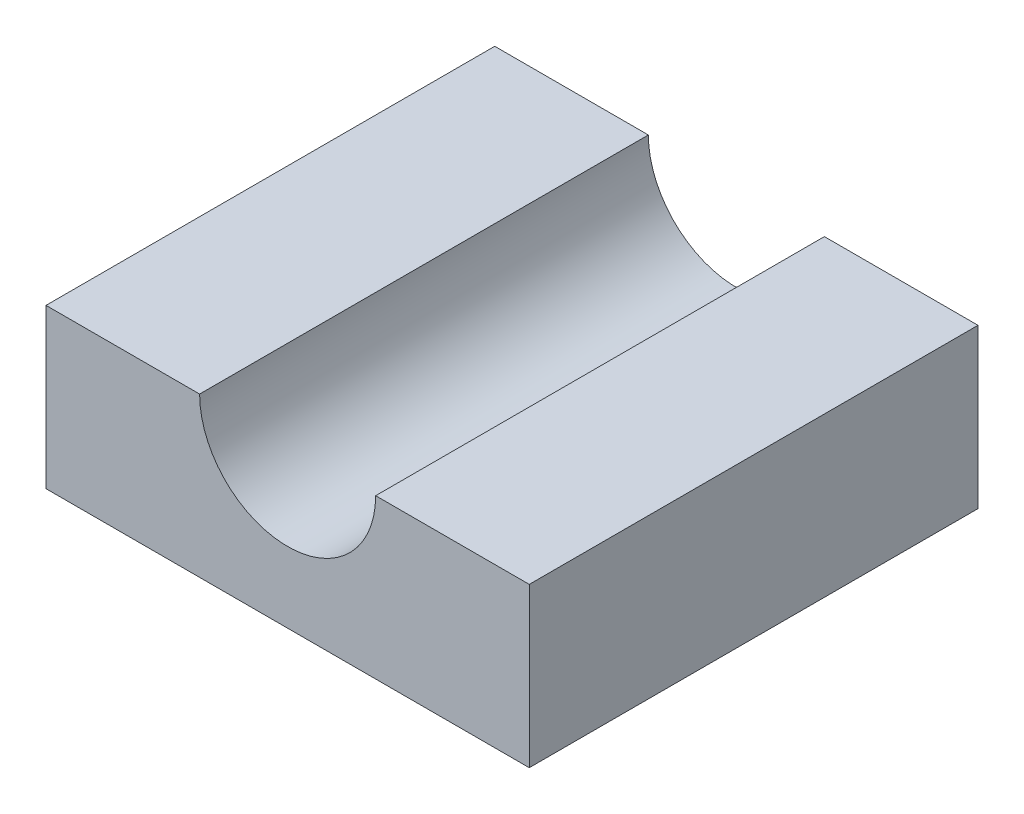
ISO-10303-21;
HEADER;
FILE_DESCRIPTION(('STEP AP214'),'2;1');
FILE_NAME('part.step','',(''),(''),'','','');
FILE_SCHEMA(('AUTOMOTIVE_DESIGN { 1 0 10303 214 1 1 1 1 }'));
ENDSEC;
DATA;
#1=APPLICATION_CONTEXT('core data for automotive mechanical design processes');
#2=APPLICATION_PROTOCOL_DEFINITION('international standard','automotive_design',2000,#1);
#3=PRODUCT_CONTEXT('',#1,'mechanical');
#4=PRODUCT('Part','Part','',(#3));
#5=PRODUCT_RELATED_PRODUCT_CATEGORY('part','',(#4));
#6=PRODUCT_DEFINITION_FORMATION('','',#4);
#7=PRODUCT_DEFINITION_CONTEXT('part definition',#1,'design');
#8=PRODUCT_DEFINITION('design','',#6,#7);
#9=PRODUCT_DEFINITION_SHAPE('','',#8);
#10=(LENGTH_UNIT() NAMED_UNIT(*) SI_UNIT(.MILLI.,.METRE.));
#11=(NAMED_UNIT(*) PLANE_ANGLE_UNIT() SI_UNIT($,.RADIAN.));
#12=(NAMED_UNIT(*) SI_UNIT($,.STERADIAN.) SOLID_ANGLE_UNIT());
#13=UNCERTAINTY_MEASURE_WITH_UNIT(LENGTH_MEASURE(1.E-05),#10,'distance_accuracy_value','');
#14=(GEOMETRIC_REPRESENTATION_CONTEXT(3) GLOBAL_UNCERTAINTY_ASSIGNED_CONTEXT((#13)) GLOBAL_UNIT_ASSIGNED_CONTEXT((#10,
#11,#12)) REPRESENTATION_CONTEXT('',''));
#15=CARTESIAN_POINT('',(0.,0.,0.));
#16=DIRECTION('',(0.,0.,1.));
#17=DIRECTION('',(1.,0.,0.));
#18=AXIS2_PLACEMENT_3D('',#15,#16,#17);
#19=CARTESIAN_POINT('',(0.,0.,-8.));
#20=DIRECTION('',(0.,0.,1.));
#21=DIRECTION('',(1.,0.,0.));
#22=AXIS2_PLACEMENT_3D('',#19,#20,#21);
#23=CYLINDRICAL_SURFACE('',#22,2.55);
#24=DIRECTION('',(0.,0.,1.));
#25=VECTOR('',#24,1.);
#26=CARTESIAN_POINT('',(2.55,0.,0.));
#27=LINE('',#26,#25);
#28=CARTESIAN_POINT('',(2.55,0.,6.));
#29=VERTEX_POINT('',#28);
#30=CARTESIAN_POINT('',(2.55,0.,-7.));
#31=VERTEX_POINT('',#30);
#32=EDGE_CURVE('E77',#29,#31,#27,.F.);
#33=ORIENTED_EDGE('',*,*,#32,.T.);
#34=CARTESIAN_POINT('',(0.,0.,-7.));
#35=DIRECTION('',(0.,0.,1.));
#36=DIRECTION('',(1.,0.,0.));
#37=AXIS2_PLACEMENT_3D('',#34,#35,#36);
#38=CIRCLE('',#37,2.55);
#39=CARTESIAN_POINT('',(-2.55,0.,-7.));
#40=VERTEX_POINT('',#39);
#41=EDGE_CURVE('E71',#40,#31,#38,.T.);
#42=ORIENTED_EDGE('',*,*,#41,.F.);
#43=DIRECTION('',(0.,0.,1.));
#44=VECTOR('',#43,1.);
#45=CARTESIAN_POINT('',(-2.55,0.,0.));
#46=LINE('',#45,#44);
#47=CARTESIAN_POINT('',(-2.55,0.,6.));
#48=VERTEX_POINT('',#47);
#49=EDGE_CURVE('E68',#40,#48,#46,.T.);
#50=ORIENTED_EDGE('',*,*,#49,.T.);
#51=CARTESIAN_POINT('',(0.,0.,6.));
#52=DIRECTION('',(0.,0.,1.));
#53=DIRECTION('',(1.,0.,0.));
#54=AXIS2_PLACEMENT_3D('',#51,#52,#53);
#55=CIRCLE('',#54,2.55);
#56=EDGE_CURVE('E19',#29,#48,#55,.F.);
#57=ORIENTED_EDGE('',*,*,#56,.F.);
#58=EDGE_LOOP('',(#33,#42,#50,#57));
#59=FACE_BOUND('',#58,.T.);
#60=ADVANCED_FACE('F16',(#59),#23,.F.);
#61=CARTESIAN_POINT('',(0.,0.,0.));
#62=DIRECTION('',(0.,-1.,0.));
#63=DIRECTION('',(1.,0.,0.));
#64=AXIS2_PLACEMENT_3D('',#61,#62,#63);
#65=PLANE('',#64);
#66=DIRECTION('',(1.,0.,0.));
#67=VECTOR('',#66,1.);
#68=CARTESIAN_POINT('',(7.,0.,6.));
#69=LINE('',#68,#67);
#70=CARTESIAN_POINT('',(7.,0.,6.));
#71=VERTEX_POINT('',#70);
#72=EDGE_CURVE('E92',#71,#29,#69,.F.);
#73=ORIENTED_EDGE('',*,*,#72,.F.);
#74=DIRECTION('',(0.,0.,1.));
#75=VECTOR('',#74,1.);
#76=CARTESIAN_POINT('',(7.,0.,-7.));
#77=LINE('',#76,#75);
#78=CARTESIAN_POINT('',(7.,0.,-7.));
#79=VERTEX_POINT('',#78);
#80=EDGE_CURVE('E76',#79,#71,#77,.T.);
#81=ORIENTED_EDGE('',*,*,#80,.F.);
#82=DIRECTION('',(-1.,0.,0.));
#83=VECTOR('',#82,1.);
#84=CARTESIAN_POINT('',(-7.,0.,-7.));
#85=LINE('',#84,#83);
#86=EDGE_CURVE('E129',#31,#79,#85,.F.);
#87=ORIENTED_EDGE('',*,*,#86,.F.);
#88=ORIENTED_EDGE('',*,*,#32,.F.);
#89=EDGE_LOOP('',(#73,#81,#87,#88));
#90=FACE_BOUND('',#89,.T.);
#91=ADVANCED_FACE('F165',(#90),#65,.F.);
#92=CARTESIAN_POINT('',(0.,0.,0.));
#93=DIRECTION('',(0.,-1.,0.));
#94=DIRECTION('',(1.,0.,0.));
#95=AXIS2_PLACEMENT_3D('',#92,#93,#94);
#96=PLANE('',#95);
#97=DIRECTION('',(-1.,0.,0.));
#98=VECTOR('',#97,1.);
#99=CARTESIAN_POINT('',(-7.,0.,-7.));
#100=LINE('',#99,#98);
#101=CARTESIAN_POINT('',(-7.,0.,-7.));
#102=VERTEX_POINT('',#101);
#103=EDGE_CURVE('E127',#102,#40,#100,.F.);
#104=ORIENTED_EDGE('',*,*,#103,.F.);
#105=DIRECTION('',(0.,0.,1.));
#106=VECTOR('',#105,1.);
#107=CARTESIAN_POINT('',(-7.,0.,6.));
#108=LINE('',#107,#106);
#109=CARTESIAN_POINT('',(-7.,0.,6.));
#110=VERTEX_POINT('',#109);
#111=EDGE_CURVE('E82',#110,#102,#108,.F.);
#112=ORIENTED_EDGE('',*,*,#111,.F.);
#113=DIRECTION('',(1.,0.,0.));
#114=VECTOR('',#113,1.);
#115=CARTESIAN_POINT('',(7.,0.,6.));
#116=LINE('',#115,#114);
#117=EDGE_CURVE('E80',#48,#110,#116,.F.);
#118=ORIENTED_EDGE('',*,*,#117,.F.);
#119=ORIENTED_EDGE('',*,*,#49,.F.);
#120=EDGE_LOOP('',(#104,#112,#118,#119));
#121=FACE_BOUND('',#120,.T.);
#122=ADVANCED_FACE('F81',(#121),#96,.F.);
#123=CARTESIAN_POINT('',(7.,0.,-7.));
#124=DIRECTION('',(1.,0.,0.));
#125=DIRECTION('',(0.,1.,0.));
#126=AXIS2_PLACEMENT_3D('',#123,#124,#125);
#127=PLANE('',#126);
#128=DIRECTION('',(0.,0.,1.));
#129=VECTOR('',#128,1.);
#130=CARTESIAN_POINT('',(7.,-4.6,0.));
#131=LINE('',#130,#129);
#132=CARTESIAN_POINT('',(7.,-4.6,-7.));
#133=VERTEX_POINT('',#132);
#134=CARTESIAN_POINT('',(7.,-4.6,6.));
#135=VERTEX_POINT('',#134);
#136=EDGE_CURVE('E121',#133,#135,#131,.T.);
#137=ORIENTED_EDGE('',*,*,#136,.F.);
#138=DIRECTION('',(0.,1.,0.));
#139=VECTOR('',#138,1.);
#140=CARTESIAN_POINT('',(7.,0.,-7.));
#141=LINE('',#140,#139);
#142=EDGE_CURVE('E133',#79,#133,#141,.F.);
#143=ORIENTED_EDGE('',*,*,#142,.F.);
#144=ORIENTED_EDGE('',*,*,#80,.T.);
#145=DIRECTION('',(0.,1.,0.));
#146=VECTOR('',#145,1.);
#147=CARTESIAN_POINT('',(7.,0.,6.));
#148=LINE('',#147,#146);
#149=EDGE_CURVE('E86',#135,#71,#148,.T.);
#150=ORIENTED_EDGE('',*,*,#149,.F.);
#151=EDGE_LOOP('',(#137,#143,#144,#150));
#152=FACE_BOUND('',#151,.T.);
#153=ADVANCED_FACE('F167',(#152),#127,.T.);
#154=CARTESIAN_POINT('',(7.,0.,6.));
#155=DIRECTION('',(0.,0.,1.));
#156=DIRECTION('',(1.,0.,0.));
#157=AXIS2_PLACEMENT_3D('',#154,#155,#156);
#158=PLANE('',#157);
#159=ORIENTED_EDGE('',*,*,#149,.T.);
#160=ORIENTED_EDGE('',*,*,#72,.T.);
#161=ORIENTED_EDGE('',*,*,#56,.T.);
#162=ORIENTED_EDGE('',*,*,#117,.T.);
#163=DIRECTION('',(0.,-1.,0.));
#164=VECTOR('',#163,1.);
#165=CARTESIAN_POINT('',(-7.,0.,6.));
#166=LINE('',#165,#164);
#167=CARTESIAN_POINT('',(-7.,-4.6,6.));
#168=VERTEX_POINT('',#167);
#169=EDGE_CURVE('E109',#168,#110,#166,.F.);
#170=ORIENTED_EDGE('',*,*,#169,.F.);
#171=DIRECTION('',(1.,0.,0.));
#172=VECTOR('',#171,1.);
#173=CARTESIAN_POINT('',(0.,-4.6,6.));
#174=LINE('',#173,#172);
#175=EDGE_CURVE('E117',#135,#168,#174,.F.);
#176=ORIENTED_EDGE('',*,*,#175,.F.);
#177=EDGE_LOOP('',(#159,#160,#161,#162,#170,#176));
#178=FACE_BOUND('',#177,.T.);
#179=ADVANCED_FACE('F90',(#178),#158,.T.);
#180=CARTESIAN_POINT('',(-7.,0.,6.));
#181=DIRECTION('',(-1.,0.,0.));
#182=DIRECTION('',(0.,-1.,0.));
#183=AXIS2_PLACEMENT_3D('',#180,#181,#182);
#184=PLANE('',#183);
#185=DIRECTION('',(0.,0.,1.));
#186=VECTOR('',#185,1.);
#187=CARTESIAN_POINT('',(-7.,-4.6,0.));
#188=LINE('',#187,#186);
#189=CARTESIAN_POINT('',(-7.,-4.6,-7.));
#190=VERTEX_POINT('',#189);
#191=EDGE_CURVE('E26',#168,#190,#188,.F.);
#192=ORIENTED_EDGE('',*,*,#191,.F.);
#193=ORIENTED_EDGE('',*,*,#169,.T.);
#194=ORIENTED_EDGE('',*,*,#111,.T.);
#195=DIRECTION('',(0.,1.,0.));
#196=VECTOR('',#195,1.);
#197=CARTESIAN_POINT('',(-7.,0.,-7.));
#198=LINE('',#197,#196);
#199=EDGE_CURVE('E35',#190,#102,#198,.T.);
#200=ORIENTED_EDGE('',*,*,#199,.F.);
#201=EDGE_LOOP('',(#192,#193,#194,#200));
#202=FACE_BOUND('',#201,.T.);
#203=ADVANCED_FACE('F172',(#202),#184,.T.);
#204=CARTESIAN_POINT('',(-7.,0.,-7.));
#205=DIRECTION('',(0.,0.,-1.));
#206=DIRECTION('',(-1.,0.,0.));
#207=AXIS2_PLACEMENT_3D('',#204,#205,#206);
#208=PLANE('',#207);
#209=ORIENTED_EDGE('',*,*,#199,.T.);
#210=ORIENTED_EDGE('',*,*,#103,.T.);
#211=ORIENTED_EDGE('',*,*,#41,.T.);
#212=ORIENTED_EDGE('',*,*,#86,.T.);
#213=ORIENTED_EDGE('',*,*,#142,.T.);
#214=DIRECTION('',(1.,0.,0.));
#215=VECTOR('',#214,1.);
#216=CARTESIAN_POINT('',(0.,-4.6,-7.));
#217=LINE('',#216,#215);
#218=EDGE_CURVE('E11',#190,#133,#217,.T.);
#219=ORIENTED_EDGE('',*,*,#218,.F.);
#220=EDGE_LOOP('',(#209,#210,#211,#212,#213,#219));
#221=FACE_BOUND('',#220,.T.);
#222=ADVANCED_FACE('F168',(#221),#208,.T.);
#223=CARTESIAN_POINT('',(0.,-4.6,0.));
#224=DIRECTION('',(0.,-1.,0.));
#225=DIRECTION('',(1.,0.,0.));
#226=AXIS2_PLACEMENT_3D('',#223,#224,#225);
#227=PLANE('',#226);
#228=ORIENTED_EDGE('',*,*,#191,.T.);
#229=ORIENTED_EDGE('',*,*,#218,.T.);
#230=ORIENTED_EDGE('',*,*,#136,.T.);
#231=ORIENTED_EDGE('',*,*,#175,.T.);
#232=EDGE_LOOP('',(#228,#229,#230,#231));
#233=FACE_BOUND('',#232,.T.);
#234=ADVANCED_FACE('F170',(#233),#227,.T.);
#235=CLOSED_SHELL('',(#60,#91,#122,#153,#179,#203,#222,#234));
#236=MANIFOLD_SOLID_BREP('B1',#235);
#237=ADVANCED_BREP_SHAPE_REPRESENTATION('',(#18,#236),#14);
#238=SHAPE_DEFINITION_REPRESENTATION(#9,#237);
ENDSEC;
END-ISO-10303-21;
